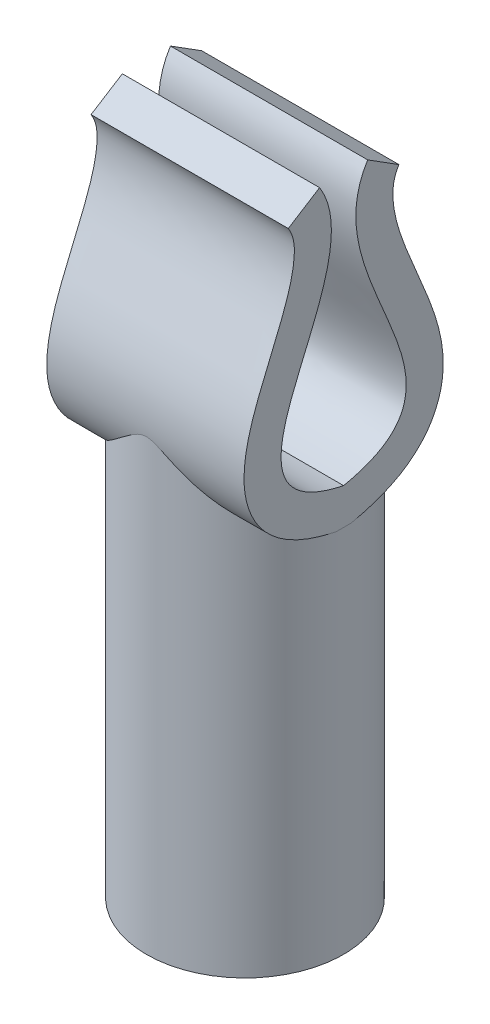
ISO-10303-21;
HEADER;
FILE_DESCRIPTION(('STEP AP214'),'2;1');
FILE_NAME('part.step','',(''),(''),'','','');
FILE_SCHEMA(('AUTOMOTIVE_DESIGN { 1 0 10303 214 1 1 1 1 }'));
ENDSEC;
DATA;
#1=APPLICATION_CONTEXT('core data for automotive mechanical design processes');
#2=APPLICATION_PROTOCOL_DEFINITION('international standard','automotive_design',2000,#1);
#3=PRODUCT_CONTEXT('',#1,'mechanical');
#4=PRODUCT('Part','Part','',(#3));
#5=PRODUCT_RELATED_PRODUCT_CATEGORY('part','',(#4));
#6=PRODUCT_DEFINITION_FORMATION('','',#4);
#7=PRODUCT_DEFINITION_CONTEXT('part definition',#1,'design');
#8=PRODUCT_DEFINITION('design','',#6,#7);
#9=PRODUCT_DEFINITION_SHAPE('','',#8);
#10=(LENGTH_UNIT() NAMED_UNIT(*) SI_UNIT(.MILLI.,.METRE.));
#11=(NAMED_UNIT(*) PLANE_ANGLE_UNIT() SI_UNIT($,.RADIAN.));
#12=(NAMED_UNIT(*) SI_UNIT($,.STERADIAN.) SOLID_ANGLE_UNIT());
#13=UNCERTAINTY_MEASURE_WITH_UNIT(LENGTH_MEASURE(1.E-05),#10,'distance_accuracy_value','');
#14=(GEOMETRIC_REPRESENTATION_CONTEXT(3) GLOBAL_UNCERTAINTY_ASSIGNED_CONTEXT((#13)) GLOBAL_UNIT_ASSIGNED_CONTEXT((#10,
#11,#12)) REPRESENTATION_CONTEXT('',''));
#15=CARTESIAN_POINT('',(0.,0.,0.));
#16=DIRECTION('',(0.,0.,1.));
#17=DIRECTION('',(1.,0.,0.));
#18=AXIS2_PLACEMENT_3D('',#15,#16,#17);
#19=CARTESIAN_POINT('',(4.,7.03164583504196,0.));
#20=DIRECTION('',(0.,1.,0.));
#21=DIRECTION('',(0.,0.,1.));
#22=AXIS2_PLACEMENT_3D('',#19,#20,#21);
#23=PLANE('',#22);
#24=DIRECTION('',(-1.,0.,0.));
#25=VECTOR('',#24,1.);
#26=CARTESIAN_POINT('',(4.,7.03164583504196,0.306489879523566));
#27=LINE('',#26,#25);
#28=CARTESIAN_POINT('',(4.,7.03164583504196,0.306489879523566));
#29=VERTEX_POINT('',#28);
#30=CARTESIAN_POINT('',(3.9882407091034,7.03164583504196,0.306489879523566));
#31=VERTEX_POINT('',#30);
#32=EDGE_CURVE('E137',#29,#31,#27,.T.);
#33=ORIENTED_EDGE('',*,*,#32,.T.);
#34=CARTESIAN_POINT('',(0.,7.03164583504196,0.));
#35=DIRECTION('',(0.,1.,0.));
#36=DIRECTION('',(0.,0.,1.));
#37=AXIS2_PLACEMENT_3D('',#34,#35,#36);
#38=CIRCLE('',#37,4.);
#39=CARTESIAN_POINT('',(4.,7.03164583504196,0.));
#40=VERTEX_POINT('',#39);
#41=EDGE_CURVE('E148',#40,#31,#38,.F.);
#42=ORIENTED_EDGE('',*,*,#41,.F.);
#43=DIRECTION('',(0.,0.,-1.));
#44=VECTOR('',#43,1.);
#45=CARTESIAN_POINT('',(4.,7.03164583504196,0.));
#46=LINE('',#45,#44);
#47=EDGE_CURVE('E234',#29,#40,#46,.T.);
#48=ORIENTED_EDGE('',*,*,#47,.F.);
#49=EDGE_LOOP('',(#33,#42,#48));
#50=FACE_BOUND('',#49,.T.);
#51=ADVANCED_FACE('F41',(#50),#23,.F.);
#52=CARTESIAN_POINT('',(4.,7.03164583504196,-0.306489879523566));
#53=VERTEX_POINT('',#52);
#54=EDGE_CURVE('E259',#40,#53,#46,.T.);
#55=ORIENTED_EDGE('',*,*,#54,.F.);
#56=CARTESIAN_POINT('',(3.98824070910341,7.03164583504196,-0.306489879523566));
#57=VERTEX_POINT('',#56);
#58=EDGE_CURVE('E69',#57,#40,#38,.F.);
#59=ORIENTED_EDGE('',*,*,#58,.F.);
#60=DIRECTION('',(-1.,0.,0.));
#61=VECTOR('',#60,1.);
#62=CARTESIAN_POINT('',(4.,7.03164583504196,-0.306489879523566));
#63=LINE('',#62,#61);
#64=EDGE_CURVE('E53',#53,#57,#63,.T.);
#65=ORIENTED_EDGE('',*,*,#64,.F.);
#66=EDGE_LOOP('',(#55,#59,#65));
#67=FACE_BOUND('',#66,.T.);
#68=ADVANCED_FACE('F346',(#67),#23,.F.);
#69=CARTESIAN_POINT('',(-3.98824070910341,7.03164583504196,-0.306489879523566));
#70=VERTEX_POINT('',#69);
#71=CARTESIAN_POINT('',(-4.,7.03164583504196,-0.306489879523566));
#72=VERTEX_POINT('',#71);
#73=EDGE_CURVE('E46',#70,#72,#63,.T.);
#74=ORIENTED_EDGE('',*,*,#73,.F.);
#75=CARTESIAN_POINT('',(-4.,7.03164583504196,0.));
#76=VERTEX_POINT('',#75);
#77=EDGE_CURVE('E146',#76,#70,#38,.F.);
#78=ORIENTED_EDGE('',*,*,#77,.F.);
#79=DIRECTION('',(0.,0.,-1.));
#80=VECTOR('',#79,1.);
#81=CARTESIAN_POINT('',(-4.,7.03164583504196,0.));
#82=LINE('',#81,#80);
#83=EDGE_CURVE('E253',#76,#72,#82,.T.);
#84=ORIENTED_EDGE('',*,*,#83,.T.);
#85=EDGE_LOOP('',(#74,#78,#84));
#86=FACE_BOUND('',#85,.T.);
#87=ADVANCED_FACE('F313',(#86),#23,.F.);
#88=CARTESIAN_POINT('',(-4.,7.03164583504196,0.306489879523566));
#89=VERTEX_POINT('',#88);
#90=EDGE_CURVE('E142',#89,#76,#82,.T.);
#91=ORIENTED_EDGE('',*,*,#90,.T.);
#92=CARTESIAN_POINT('',(-3.9882407091034,7.03164583504196,0.306489879523566));
#93=VERTEX_POINT('',#92);
#94=EDGE_CURVE('E140',#93,#76,#38,.F.);
#95=ORIENTED_EDGE('',*,*,#94,.F.);
#96=EDGE_CURVE('E124',#93,#89,#27,.T.);
#97=ORIENTED_EDGE('',*,*,#96,.T.);
#98=EDGE_LOOP('',(#91,#95,#97));
#99=FACE_BOUND('',#98,.T.);
#100=ADVANCED_FACE('F141',(#99),#23,.F.);
#101=CARTESIAN_POINT('',(4.,7.03164583504196,-0.306489879523566));
#102=CARTESIAN_POINT('',(4.,7.07829473029853,-0.529978823912705));
#103=CARTESIAN_POINT('',(4.,7.19011564463256,-0.984294969082046));
#104=CARTESIAN_POINT('',(4.,7.46538874891517,-1.78859758283275));
#105=CARTESIAN_POINT('',(4.,7.9377015792707,-2.6821833740175));
#106=CARTESIAN_POINT('',(4.,8.79289043839185,-3.53008841360021));
#107=CARTESIAN_POINT('',(4.,9.86950815960972,-3.99375196436386));
#108=CARTESIAN_POINT('',(4.,10.9200616971611,-4.07326898230156));
#109=CARTESIAN_POINT('',(4.,12.1870395307715,-3.8853574623859));
#110=CARTESIAN_POINT('',(4.,13.6180263802724,-3.36010862412962));
#111=CARTESIAN_POINT('',(4.,15.2523621249921,-2.63599918272506));
#112=CARTESIAN_POINT('',(4.,16.7588465155459,-2.07993407535756));
#113=CARTESIAN_POINT('',(4.,17.9329515339334,-1.93748110870911));
#114=CARTESIAN_POINT('',(4.,18.4202873447502,-2.09625883810497));
#115=CARTESIAN_POINT('',(4.,18.6549413655216,-2.24420265934673));
#116=B_SPLINE_CURVE_WITH_KNOTS('',3,(#101,#102,#103,#104,#105,#106,#107,#108,#109,#110,#111,
#112,#113,#114,#115),.UNSPECIFIED.,.F.,.F.,(4,1,1,1,1,1,1,1,1,1,1,1,4),(0.,0.03125,0.0625,0.125,
0.1875,0.25,0.3125,0.375,0.5,0.625,0.75,0.875,1.),.UNSPECIFIED.);
#117=DIRECTION('',(-1.,0.,0.));
#118=VECTOR('',#117,1.);
#119=SURFACE_OF_LINEAR_EXTRUSION('',#116,#118);
#120=ORIENTED_EDGE('',*,*,#64,.T.);
#121=CARTESIAN_POINT('',(-3.98824070910341,7.03164583504196,-0.306489879523566));
#122=CARTESIAN_POINT('',(-3.98405283103163,7.04302816264918,-0.360997256579708));
#123=CARTESIAN_POINT('',(-3.97875310302046,7.05486801810956,-0.415322195721255));
#124=CARTESIAN_POINT('',(-3.96596833131764,7.07945272145702,-0.523507570965624));
#125=CARTESIAN_POINT('',(-3.95848331576204,7.09219755769067,-0.577368013039755));
#126=CARTESIAN_POINT('',(-3.94136873007118,7.1185786197941,-0.684510607986535));
#127=CARTESIAN_POINT('',(-3.93173978367505,7.13221458559182,-0.737792924336011));
#128=CARTESIAN_POINT('',(-3.91038487089869,7.16039979463419,-0.843687680076051));
#129=CARTESIAN_POINT('',(-3.89865890063233,7.17494903957126,-0.896300118225026));
#130=CARTESIAN_POINT('',(-3.86051869782255,7.21994128851747,-1.05254448535815));
#131=CARTESIAN_POINT('',(-3.83106865233917,7.251839809395,-1.15503964507691));
#132=CARTESIAN_POINT('',(-3.76459056897165,7.31971784269199,-1.35612761225122));
#133=CARTESIAN_POINT('',(-3.72756232222633,7.3556974675777,-1.45472031206252));
#134=CARTESIAN_POINT('',(-3.6465166760738,7.43151701711118,-1.6473691348383));
#135=CARTESIAN_POINT('',(-3.60250334834641,7.47135468762132,-1.74142785931884));
#136=CARTESIAN_POINT('',(-3.50812703518449,7.55492038578552,-1.92448751734082));
#137=CARTESIAN_POINT('',(-3.45776402652973,7.59864842766615,-2.01348843238455));
#138=CARTESIAN_POINT('',(-3.3513788025478,7.68997761676463,-2.18598462180309));
#139=CARTESIAN_POINT('',(-3.29535522848757,7.73757969334992,-2.26947856632594));
#140=CARTESIAN_POINT('',(-3.17839092239686,7.83647156559751,-2.43058640918756));
#141=CARTESIAN_POINT('',(-3.11745015615907,7.88776138691397,-2.50820026661322));
#142=CARTESIAN_POINT('',(-2.91984230061578,8.05389309392452,-2.74187552475354));
#143=CARTESIAN_POINT('',(-2.77553744146553,8.17495742561499,-2.88729349370202));
#144=CARTESIAN_POINT('',(-2.54859453666478,8.36523427425642,-3.08460285605666));
#145=CARTESIAN_POINT('',(-2.47110009504162,8.4301897025046,-3.14696525944243));
#146=CARTESIAN_POINT('',(-2.31315451933374,8.56274327078663,-3.26481357243536));
#147=CARTESIAN_POINT('',(-2.23270374887683,8.63034108587224,-3.32030032409994));
#148=CARTESIAN_POINT('',(-2.11122671423137,8.73278197411684,-3.3977879085054));
#149=CARTESIAN_POINT('',(-2.07106735860551,8.76670688847091,-3.4224083347003));
#150=CARTESIAN_POINT('',(-1.9902836970055,8.8351483200708,-3.47000978981311));
#151=CARTESIAN_POINT('',(-1.94965940042187,8.8696648253751,-3.49299085177406));
#152=CARTESIAN_POINT('',(-1.82709112260131,8.97402265521261,-3.55954954905926));
#153=CARTESIAN_POINT('',(-1.74448948078188,9.04464044373321,-3.60071873124575));
#154=CARTESIAN_POINT('',(-1.57747744315206,9.18717383220193,-3.67695505661959));
#155=CARTESIAN_POINT('',(-1.49306538850701,9.259090611951,-3.71201630931468));
#156=CARTESIAN_POINT('',(-1.32247303944383,9.40323013764949,-3.77615725697355));
#157=CARTESIAN_POINT('',(-1.23629551498162,9.47545228144013,-3.80524563476213));
#158=CARTESIAN_POINT('',(-1.10533638280667,9.58321966206353,-3.84451581192061));
#159=CARTESIAN_POINT('',(-1.0614180604806,9.61903443122357,-3.85687497072196));
#160=CARTESIAN_POINT('',(-0.972897655960138,9.69028411444549,-3.88015026940244));
#161=CARTESIAN_POINT('',(-0.928295622036755,9.72571905502637,-3.89106651063472));
#162=CARTESIAN_POINT('',(-0.838312503319054,9.79587635297652,-3.9114392238495));
#163=CARTESIAN_POINT('',(-0.79293263174264,9.83059966224615,-3.92089777352903));
#164=CARTESIAN_POINT('',(-0.701086138300713,9.89894990749165,-3.93835841981289));
#165=CARTESIAN_POINT('',(-0.654619818803334,9.93257714242169,-3.94636091633087));
#166=CARTESIAN_POINT('',(-0.582231778533317,9.98252363531381,-3.95748021015788));
#167=CARTESIAN_POINT('',(-0.556891761656486,9.99956591363384,-3.96112857918105));
#168=CARTESIAN_POINT('',(-0.505626589371762,10.0328537625207,-3.96799840643277));
#169=CARTESIAN_POINT('',(-0.479701327948628,10.0490991870211,-3.97121978657546));
#170=CARTESIAN_POINT('',(-0.427147096315249,10.0804547842532,-3.97721565291266));
#171=CARTESIAN_POINT('',(-0.400518787402315,10.0955659758066,-3.9799905427921));
#172=CARTESIAN_POINT('',(-0.346375432526357,10.1241839352503,-3.98506746231384));
#173=CARTESIAN_POINT('',(-0.318860771163875,10.1376913874143,-3.98736969393504));
#174=CARTESIAN_POINT('',(-0.255641524392388,10.1655807370784,-3.99197858373963));
#175=CARTESIAN_POINT('',(-0.219629933503674,10.1793152648135,-3.99413821847426));
#176=CARTESIAN_POINT('',(-0.145944251269591,10.2012597845424,-3.99750464312788));
#177=CARTESIAN_POINT('',(-0.108277079935239,10.2094908021929,-3.99871506253835));
#178=CARTESIAN_POINT('',(-0.0508393225910899,10.2163897004344,-3.99972404834428));
#179=CARTESIAN_POINT('',(-0.0313902751952663,10.2177708805299,-3.99992434839597));
#180=CARTESIAN_POINT('',(0.00755117227900924,10.2185676452993,-4.00004013260857));
#181=CARTESIAN_POINT('',(0.0270435687934826,10.2179833859973,-3.99995563937744));
#182=CARTESIAN_POINT('',(0.0658921018300201,10.2148867223586,-3.99950452758042));
#183=CARTESIAN_POINT('',(0.0852480365429091,10.2123718980602,-3.99913755492522));
#184=CARTESIAN_POINT('',(0.123646057987396,10.2055883955333,-3.99813468363372));
#185=CARTESIAN_POINT('',(0.142687980398678,10.2013188275711,-3.99749864856593));
#186=CARTESIAN_POINT('',(0.187526187592627,10.189362939954,-3.99568657976616));
#187=CARTESIAN_POINT('',(0.213134719088906,10.1809946760937,-3.99439715540143));
#188=CARTESIAN_POINT('',(0.263500488518636,10.1620763022572,-3.99139140180265));
#189=CARTESIAN_POINT('',(0.288257180212547,10.1515248216277,-3.98967480424556));
#190=CARTESIAN_POINT('',(0.33711922671321,10.1287571052821,-3.98584426148402));
#191=CARTESIAN_POINT('',(0.36122017823582,10.11653191212,-3.98372815334788));
#192=CARTESIAN_POINT('',(0.408735056297504,10.090903423664,-3.9791337026025));
#193=CARTESIAN_POINT('',(0.432149167793091,10.0775004494876,-3.97665545860686));
#194=CARTESIAN_POINT('',(0.488333193154791,10.0439030159865,-3.97021892143394));
#195=CARTESIAN_POINT('',(0.520812540284977,10.0232595354098,-3.96608148780748));
#196=CARTESIAN_POINT('',(0.584922853454069,9.98082525893608,-3.95713435164514));
#197=CARTESIAN_POINT('',(0.616553525672564,9.95903407323428,-3.95232441977321));
#198=CARTESIAN_POINT('',(0.679220774335061,9.91465188569851,-3.94203869362736));
#199=CARTESIAN_POINT('',(0.710256206175684,9.89205954264754,-3.93656174140063));
#200=CARTESIAN_POINT('',(0.771824306578336,9.84636181751774,-3.92495448350654));
#201=CARTESIAN_POINT('',(0.802356935841111,9.82325639566481,-3.91882412704603));
#202=CARTESIAN_POINT('',(0.893387033505228,9.75336537056618,-3.89945070096032));
#203=CARTESIAN_POINT('',(0.953266226080558,9.70604158467829,-3.88523363427098));
#204=CARTESIAN_POINT('',(1.07191178488216,9.61062823709599,-3.8541884386432));
#205=CARTESIAN_POINT('',(1.13067579002294,9.56253737794882,-3.83735534179306));
#206=CARTESIAN_POINT('',(1.24713087368748,9.46618155371222,-3.80110232163875));
#207=CARTESIAN_POINT('',(1.30482315049787,9.41791686537163,-3.78168551378743));
#208=CARTESIAN_POINT('',(1.41932499193763,9.32149398537577,-3.74021696486565));
#209=CARTESIAN_POINT('',(1.47613470504213,9.27333577700241,-3.71816567254398));
#210=CARTESIAN_POINT('',(1.59092759227571,9.17570647221116,-3.67055095628904));
#211=CARTESIAN_POINT('',(1.64888217692771,9.12624846897247,-3.64489157236545));
#212=CARTESIAN_POINT('',(1.76396379881129,9.02798878915523,-3.59060995454607));
#213=CARTESIAN_POINT('',(1.82109078160268,8.97918715576808,-3.56198752673911));
#214=CARTESIAN_POINT('',(1.93455049957209,8.88250225150717,-3.5016629860887));
#215=CARTESIAN_POINT('',(1.99088282530256,8.83461944979069,-3.46995934757643));
#216=CARTESIAN_POINT('',(2.10263643451276,8.73999512369983,-3.4034022804509));
#217=CARTESIAN_POINT('',(2.158057738664,8.69325357341822,-3.36854892342309));
#218=CARTESIAN_POINT('',(2.26763386529706,8.60101025035019,-3.29577803786457));
#219=CARTESIAN_POINT('',(2.32179138493322,8.55550579484547,-3.25786798936053));
#220=CARTESIAN_POINT('',(2.4287839398402,8.46569499894749,-3.17890403423551));
#221=CARTESIAN_POINT('',(2.48161893464576,8.42138869521071,-3.13785003157468));
#222=CARTESIAN_POINT('',(2.63782626555723,8.29041156381997,-3.00997837402342));
#223=CARTESIAN_POINT('',(2.73897029625553,8.20562434323371,-2.91840536402363));
#224=CARTESIAN_POINT('',(2.90972980020286,8.06233115087673,-2.74669251933424));
#225=CARTESIAN_POINT('',(2.98098282053822,8.00248898273056,-2.66927741364593));
#226=CARTESIAN_POINT('',(3.11847714019249,7.88689973354956,-2.50726469391196));
#227=CARTESIAN_POINT('',(3.18471929565554,7.83115195300522,-2.42266831210724));
#228=CARTESIAN_POINT('',(3.3113019505325,7.72405994712045,-2.24656159965423));
#229=CARTESIAN_POINT('',(3.37164300171616,7.67271531012917,-2.15505191683984));
#230=CARTESIAN_POINT('',(3.48551605155661,7.5746188129915,-1.96555116018678));
#231=CARTESIAN_POINT('',(3.53904821707552,7.52786684030129,-1.86756024527007));
#232=CARTESIAN_POINT('',(3.63439486729112,7.44252756615793,-1.67387950177786));
#233=CARTESIAN_POINT('',(3.67680556329731,7.40358600619296,-1.57863874574187));
#234=CARTESIAN_POINT('',(3.75447780086535,7.32963204503906,-1.3837973398905));
#235=CARTESIAN_POINT('',(3.78973900372272,7.29461983003638,-1.28419648378872));
#236=CARTESIAN_POINT('',(3.85249104531977,7.22874295112647,-1.08145774293377));
#237=CARTESIAN_POINT('',(3.87999535454191,7.19787114658181,-0.978326343015627));
#238=CARTESIAN_POINT('',(3.92679819189405,7.13986605828849,-0.769236110763174));
#239=CARTESIAN_POINT('',(3.94610125418074,7.112730714417,-0.663278875254082));
#240=CARTESIAN_POINT('',(3.96693602093165,7.07752915541253,-0.514945478303809));
#241=CARTESIAN_POINT('',(3.97210842190944,7.06796935043256,-0.473405662718375));
#242=CARTESIAN_POINT('',(3.98115118710539,7.04939747102838,-0.39011133003229));
#243=CARTESIAN_POINT('',(3.98502297909151,7.04038480493903,-0.34835709979016));
#244=CARTESIAN_POINT('',(3.98824070910341,7.03164583504196,-0.306489879523566));
#245=B_SPLINE_CURVE_WITH_KNOTS('',3,(#121,#122,#123,#124,#125,#126,#127,#128,#129,#130,#131,
#132,#133,#134,#135,#136,#137,#138,#139,#140,#141,#142,#143,#144,#145,#146,#147,#148,#149,#150,
#151,#152,#153,#154,#155,#156,#157,#158,#159,#160,#161,#162,#163,#164,#165,#166,#167,#168,#169,
#170,#171,#172,#173,#174,#175,#176,#177,#178,#179,#180,#181,#182,#183,#184,#185,#186,#187,#188,
#189,#190,#191,#192,#193,#194,#195,#196,#197,#198,#199,#200,#201,#202,#203,#204,#205,#206,#207,
#208,#209,#210,#211,#212,#213,#214,#215,#216,#217,#218,#219,#220,#221,#222,#223,#224,#225,#226,
#227,#228,#229,#230,#231,#232,#233,#234,#235,#236,#237,#238,#239,#240,#241,#242,#243,#244),
.UNSPECIFIED.,.F.,.F.,(4,2,2,2,2,2,2,2,2,2,2,2,2,2,2,2,2,2,2,2,2,2,2,2,2,2,2,2,2,2,2,2,2,2,2,2,
2,2,2,2,2,2,2,2,2,2,2,2,2,2,2,2,2,2,2,2,2,2,2,2,2,4),(0.,0.167505622546573,0.335009088517145,
0.502463885816501,0.669918993440763,1.00340824782874,1.33690669467991,1.67021145088378,
2.0035174259892,2.33690359707709,2.67029208762306,3.38104135618793,3.73727101562797,
4.09345700460114,4.26758664088216,4.44171276641215,4.7901293855521,5.13888017987863,
5.48712034544459,5.66110939225577,5.83508621126086,6.00881271494701,6.18249143135085,
6.27474240765263,6.36701023120171,6.45919415817277,6.55133861023318,6.66685744482401,
6.78193238942608,6.84033772323703,6.8987384207187,6.95721244320075,7.01571615128245,
7.0964872778987,7.17730926843671,7.25858207054895,7.33983278228103,7.45590253685892,
7.5720119706494,7.68832592420017,7.80464892615601,8.03748345868296,8.27076567852392,
8.50376911215728,8.73673291324404,8.97785615509994,9.21899518682652,9.46025423340889,
9.70150779813591,9.94218793562891,10.1828754282266,10.6639473010408,11.0267376458219,
11.389465864464,11.7521601345114,12.11484551447,12.4483534511,12.7818771838497,13.1148181078513,
13.4475747212304,13.576371100582,13.7050256256744),.UNSPECIFIED.);
#246=EDGE_CURVE('E61',#70,#57,#245,.T.);
#247=ORIENTED_EDGE('',*,*,#246,.F.);
#248=ORIENTED_EDGE('',*,*,#73,.T.);
#249=CARTESIAN_POINT('',(-4.,7.03164583504196,-0.306489879523566));
#250=CARTESIAN_POINT('',(-4.,7.07829473029853,-0.529978823912705));
#251=CARTESIAN_POINT('',(-4.,7.19011564463256,-0.984294969082046));
#252=CARTESIAN_POINT('',(-4.,7.46538874891517,-1.78859758283275));
#253=CARTESIAN_POINT('',(-4.,7.9377015792707,-2.6821833740175));
#254=CARTESIAN_POINT('',(-4.,8.79289043839185,-3.53008841360021));
#255=CARTESIAN_POINT('',(-4.,9.86950815960972,-3.99375196436386));
#256=CARTESIAN_POINT('',(-4.,10.9200616971611,-4.07326898230156));
#257=CARTESIAN_POINT('',(-4.,12.1870395307715,-3.8853574623859));
#258=CARTESIAN_POINT('',(-4.,13.6180263802724,-3.36010862412962));
#259=CARTESIAN_POINT('',(-4.,15.2523621249921,-2.63599918272506));
#260=CARTESIAN_POINT('',(-4.,16.7588465155459,-2.07993407535756));
#261=CARTESIAN_POINT('',(-4.,17.9329515339334,-1.93748110870911));
#262=CARTESIAN_POINT('',(-4.,18.4202873447502,-2.09625883810497));
#263=CARTESIAN_POINT('',(-4.,18.6549413655216,-2.24420265934673));
#264=B_SPLINE_CURVE_WITH_KNOTS('',3,(#249,#250,#251,#252,#253,#254,#255,#256,#257,#258,#259,
#260,#261,#262,#263),.UNSPECIFIED.,.F.,.F.,(4,1,1,1,1,1,1,1,1,1,1,1,4),(0.,0.03125,0.0625,0.125,
0.1875,0.25,0.3125,0.375,0.5,0.625,0.75,0.875,1.),.UNSPECIFIED.);
#265=CARTESIAN_POINT('',(-4.,18.6549413655216,-2.24420265934673));
#266=VERTEX_POINT('',#265);
#267=EDGE_CURVE('E299',#72,#266,#264,.T.);
#268=ORIENTED_EDGE('',*,*,#267,.T.);
#269=DIRECTION('',(-1.,0.,0.));
#270=VECTOR('',#269,1.);
#271=CARTESIAN_POINT('',(4.,18.6549413655216,-2.24420265934673));
#272=LINE('',#271,#270);
#273=CARTESIAN_POINT('',(4.,18.6549413655216,-2.24420265934673));
#274=VERTEX_POINT('',#273);
#275=EDGE_CURVE('E289',#274,#266,#272,.T.);
#276=ORIENTED_EDGE('',*,*,#275,.F.);
#277=EDGE_CURVE('E226',#53,#274,#116,.T.);
#278=ORIENTED_EDGE('',*,*,#277,.F.);
#279=EDGE_LOOP('',(#120,#247,#248,#268,#276,#278));
#280=FACE_BOUND('',#279,.T.);
#281=ADVANCED_FACE('F223',(#280),#119,.F.);
#282=CARTESIAN_POINT('',(4.,19.4549305343332,-0.97533807642857));
#283=CARTESIAN_POINT('',(4.,15.650726712737,1.42312263734572));
#284=CARTESIAN_POINT('',(4.,9.81616264931179,-6.30556842817573));
#285=CARTESIAN_POINT('',(4.,8.5,0.));
#286=B_SPLINE_CURVE_WITH_KNOTS('',3,(#282,#283,#284,#285),.UNSPECIFIED.,.F.,.F.,(4,4),(0.,1.),.UNSPECIFIED.);
#287=DIRECTION('',(-1.,0.,0.));
#288=VECTOR('',#287,1.);
#289=SURFACE_OF_LINEAR_EXTRUSION('',#286,#288);
#290=CARTESIAN_POINT('',(-4.,19.4549305343332,-0.97533807642857));
#291=CARTESIAN_POINT('',(-4.,15.650726712737,1.42312263734572));
#292=CARTESIAN_POINT('',(-4.,9.81616264931179,-6.30556842817573));
#293=CARTESIAN_POINT('',(-4.,8.5,0.));
#294=B_SPLINE_CURVE_WITH_KNOTS('',3,(#290,#291,#292,#293),.UNSPECIFIED.,.F.,.F.,(4,4),(0.,1.),.UNSPECIFIED.);
#295=CARTESIAN_POINT('',(-4.,19.4549305343332,-0.97533807642857));
#296=VERTEX_POINT('',#295);
#297=CARTESIAN_POINT('',(-4.,8.5,0.));
#298=VERTEX_POINT('',#297);
#299=EDGE_CURVE('E250',#296,#298,#294,.T.);
#300=ORIENTED_EDGE('',*,*,#299,.T.);
#301=DIRECTION('',(-1.,0.,0.));
#302=VECTOR('',#301,1.);
#303=CARTESIAN_POINT('',(4.,8.5,0.));
#304=LINE('',#303,#302);
#305=CARTESIAN_POINT('',(4.,8.5,0.));
#306=VERTEX_POINT('',#305);
#307=EDGE_CURVE('E11',#306,#298,#304,.T.);
#308=ORIENTED_EDGE('',*,*,#307,.F.);
#309=CARTESIAN_POINT('',(4.,19.4549305343332,-0.97533807642857));
#310=VERTEX_POINT('',#309);
#311=EDGE_CURVE('E257',#310,#306,#286,.T.);
#312=ORIENTED_EDGE('',*,*,#311,.F.);
#313=DIRECTION('',(-1.,0.,0.));
#314=VECTOR('',#313,1.);
#315=CARTESIAN_POINT('',(4.,19.4549305343332,-0.97533807642857));
#316=LINE('',#315,#314);
#317=EDGE_CURVE('E240',#310,#296,#316,.T.);
#318=ORIENTED_EDGE('',*,*,#317,.T.);
#319=EDGE_LOOP('',(#300,#308,#312,#318));
#320=FACE_BOUND('',#319,.T.);
#321=ADVANCED_FACE('F43',(#320),#289,.F.);
#322=CARTESIAN_POINT('',(4.,19.4549305343332,-0.97533807642857));
#323=DIRECTION('',(0.,-0.845909721945438,0.53332611254109));
#324=DIRECTION('',(0.,-0.53332611254109,-0.845909721945438));
#325=AXIS2_PLACEMENT_3D('',#322,#323,#324);
#326=PLANE('',#325);
#327=DIRECTION('',(0.,0.53332611254109,0.845909721945438));
#328=VECTOR('',#327,1.);
#329=CARTESIAN_POINT('',(-4.,19.4549305343332,-0.97533807642857));
#330=LINE('',#329,#328);
#331=EDGE_CURVE('E260',#266,#296,#330,.T.);
#332=ORIENTED_EDGE('',*,*,#331,.T.);
#333=ORIENTED_EDGE('',*,*,#317,.F.);
#334=DIRECTION('',(0.,0.53332611254109,0.845909721945438));
#335=VECTOR('',#334,1.);
#336=CARTESIAN_POINT('',(4.,19.4549305343332,-0.97533807642857));
#337=LINE('',#336,#335);
#338=EDGE_CURVE('E233',#274,#310,#337,.T.);
#339=ORIENTED_EDGE('',*,*,#338,.F.);
#340=ORIENTED_EDGE('',*,*,#275,.T.);
#341=EDGE_LOOP('',(#332,#333,#339,#340));
#342=FACE_BOUND('',#341,.T.);
#343=ADVANCED_FACE('F215',(#342),#326,.F.);
#344=CARTESIAN_POINT('',(4.,13.04444982756,-1.95283443111482));
#345=DIRECTION('',(-1.,0.,0.));
#346=DIRECTION('',(0.,0.,1.));
#347=AXIS2_PLACEMENT_3D('',#344,#345,#346);
#348=PLANE('',#347);
#349=ORIENTED_EDGE('',*,*,#311,.T.);
#350=CARTESIAN_POINT('',(4.,19.4549305343332,0.97533807642857));
#351=CARTESIAN_POINT('',(4.,15.650726712737,-1.42312263734572));
#352=CARTESIAN_POINT('',(4.,9.81616264931179,6.30556842817573));
#353=CARTESIAN_POINT('',(4.,8.5,0.));
#354=B_SPLINE_CURVE_WITH_KNOTS('',3,(#350,#351,#352,#353),.UNSPECIFIED.,.F.,.F.,(4,4),(0.,1.),.UNSPECIFIED.);
#355=CARTESIAN_POINT('',(4.,19.4549305343332,0.97533807642857));
#356=VERTEX_POINT('',#355);
#357=EDGE_CURVE('E189',#356,#306,#354,.T.);
#358=ORIENTED_EDGE('',*,*,#357,.F.);
#359=DIRECTION('',(0.,0.53332611254109,-0.845909721945438));
#360=VECTOR('',#359,1.);
#361=CARTESIAN_POINT('',(4.,19.4549305343332,0.97533807642857));
#362=LINE('',#361,#360);
#363=CARTESIAN_POINT('',(4.,18.6549413655216,2.24420265934673));
#364=VERTEX_POINT('',#363);
#365=EDGE_CURVE('E199',#364,#356,#362,.T.);
#366=ORIENTED_EDGE('',*,*,#365,.F.);
#367=CARTESIAN_POINT('',(4.,7.03164583504196,0.306489879523566));
#368=CARTESIAN_POINT('',(4.,7.07829473029853,0.529978823912705));
#369=CARTESIAN_POINT('',(4.,7.19011564463256,0.984294969082046));
#370=CARTESIAN_POINT('',(4.,7.46538874891517,1.78859758283275));
#371=CARTESIAN_POINT('',(4.,7.9377015792707,2.6821833740175));
#372=CARTESIAN_POINT('',(4.,8.79289043839185,3.53008841360021));
#373=CARTESIAN_POINT('',(4.,9.86950815960972,3.99375196436386));
#374=CARTESIAN_POINT('',(4.,10.9200616971611,4.07326898230156));
#375=CARTESIAN_POINT('',(4.,12.1870395307715,3.8853574623859));
#376=CARTESIAN_POINT('',(4.,13.6180263802724,3.36010862412962));
#377=CARTESIAN_POINT('',(4.,15.2523621249921,2.63599918272506));
#378=CARTESIAN_POINT('',(4.,16.7588465155459,2.07993407535756));
#379=CARTESIAN_POINT('',(4.,17.9329515339334,1.93748110870911));
#380=CARTESIAN_POINT('',(4.,18.4202873447502,2.09625883810497));
#381=CARTESIAN_POINT('',(4.,18.6549413655216,2.24420265934673));
#382=B_SPLINE_CURVE_WITH_KNOTS('',3,(#367,#368,#369,#370,#371,#372,#373,#374,#375,#376,#377,
#378,#379,#380,#381),.UNSPECIFIED.,.F.,.F.,(4,1,1,1,1,1,1,1,1,1,1,1,4),(0.,0.03125,0.0625,0.125,
0.1875,0.25,0.3125,0.375,0.5,0.625,0.75,0.875,1.),.UNSPECIFIED.);
#383=EDGE_CURVE('E138',#29,#364,#382,.T.);
#384=ORIENTED_EDGE('',*,*,#383,.F.);
#385=ORIENTED_EDGE('',*,*,#47,.T.);
#386=ORIENTED_EDGE('',*,*,#54,.T.);
#387=ORIENTED_EDGE('',*,*,#277,.T.);
#388=ORIENTED_EDGE('',*,*,#338,.T.);
#389=EDGE_LOOP('',(#349,#358,#366,#384,#385,#386,#387,#388));
#390=FACE_BOUND('',#389,.T.);
#391=ADVANCED_FACE('F211',(#390),#348,.F.);
#392=CARTESIAN_POINT('',(-4.,13.04444982756,-1.95283443111482));
#393=DIRECTION('',(-1.,0.,0.));
#394=DIRECTION('',(0.,0.,1.));
#395=AXIS2_PLACEMENT_3D('',#392,#393,#394);
#396=PLANE('',#395);
#397=ORIENTED_EDGE('',*,*,#299,.F.);
#398=ORIENTED_EDGE('',*,*,#331,.F.);
#399=ORIENTED_EDGE('',*,*,#267,.F.);
#400=ORIENTED_EDGE('',*,*,#83,.F.);
#401=ORIENTED_EDGE('',*,*,#90,.F.);
#402=CARTESIAN_POINT('',(-4.,7.03164583504196,0.306489879523566));
#403=CARTESIAN_POINT('',(-4.,7.07829473029853,0.529978823912705));
#404=CARTESIAN_POINT('',(-4.,7.19011564463256,0.984294969082046));
#405=CARTESIAN_POINT('',(-4.,7.46538874891517,1.78859758283275));
#406=CARTESIAN_POINT('',(-4.,7.9377015792707,2.6821833740175));
#407=CARTESIAN_POINT('',(-4.,8.79289043839185,3.53008841360021));
#408=CARTESIAN_POINT('',(-4.,9.86950815960972,3.99375196436386));
#409=CARTESIAN_POINT('',(-4.,10.9200616971611,4.07326898230156));
#410=CARTESIAN_POINT('',(-4.,12.1870395307715,3.8853574623859));
#411=CARTESIAN_POINT('',(-4.,13.6180263802724,3.36010862412962));
#412=CARTESIAN_POINT('',(-4.,15.2523621249921,2.63599918272506));
#413=CARTESIAN_POINT('',(-4.,16.7588465155459,2.07993407535756));
#414=CARTESIAN_POINT('',(-4.,17.9329515339334,1.93748110870911));
#415=CARTESIAN_POINT('',(-4.,18.4202873447502,2.09625883810497));
#416=CARTESIAN_POINT('',(-4.,18.6549413655216,2.24420265934673));
#417=B_SPLINE_CURVE_WITH_KNOTS('',3,(#402,#403,#404,#405,#406,#407,#408,#409,#410,#411,#412,
#413,#414,#415,#416),.UNSPECIFIED.,.F.,.F.,(4,1,1,1,1,1,1,1,1,1,1,1,4),(0.,0.03125,0.0625,0.125,
0.1875,0.25,0.3125,0.375,0.5,0.625,0.75,0.875,1.),.UNSPECIFIED.);
#418=CARTESIAN_POINT('',(-4.,18.6549413655216,2.24420265934673));
#419=VERTEX_POINT('',#418);
#420=EDGE_CURVE('E132',#89,#419,#417,.T.);
#421=ORIENTED_EDGE('',*,*,#420,.T.);
#422=DIRECTION('',(0.,0.53332611254109,-0.845909721945438));
#423=VECTOR('',#422,1.);
#424=CARTESIAN_POINT('',(-4.,19.4549305343332,0.97533807642857));
#425=LINE('',#424,#423);
#426=CARTESIAN_POINT('',(-4.,19.4549305343332,0.97533807642857));
#427=VERTEX_POINT('',#426);
#428=EDGE_CURVE('E157',#419,#427,#425,.T.);
#429=ORIENTED_EDGE('',*,*,#428,.T.);
#430=CARTESIAN_POINT('',(-4.,19.4549305343332,0.97533807642857));
#431=CARTESIAN_POINT('',(-4.,15.650726712737,-1.42312263734572));
#432=CARTESIAN_POINT('',(-4.,9.81616264931179,6.30556842817573));
#433=CARTESIAN_POINT('',(-4.,8.5,0.));
#434=B_SPLINE_CURVE_WITH_KNOTS('',3,(#430,#431,#432,#433),.UNSPECIFIED.,.F.,.F.,(4,4),(0.,1.),.UNSPECIFIED.);
#435=EDGE_CURVE('E152',#427,#298,#434,.T.);
#436=ORIENTED_EDGE('',*,*,#435,.T.);
#437=EDGE_LOOP('',(#397,#398,#399,#400,#401,#421,#429,#436));
#438=FACE_BOUND('',#437,.T.);
#439=ADVANCED_FACE('F214',(#438),#396,.T.);
#440=DIRECTION('',(-1.,0.,0.));
#441=VECTOR('',#440,1.);
#442=SURFACE_OF_LINEAR_EXTRUSION('',#382,#441);
#443=CARTESIAN_POINT('',(-3.9882407091034,7.03164583504196,0.306489879523566));
#444=CARTESIAN_POINT('',(-3.98405283103163,7.04302816264918,0.360997256579708));
#445=CARTESIAN_POINT('',(-3.97875310302045,7.05486801810956,0.415322195721255));
#446=CARTESIAN_POINT('',(-3.96596833131763,7.07945272145702,0.523507570965625));
#447=CARTESIAN_POINT('',(-3.95848331576204,7.09219755769067,0.577368013039756));
#448=CARTESIAN_POINT('',(-3.94136873007118,7.1185786197941,0.684510607986536));
#449=CARTESIAN_POINT('',(-3.93173978367504,7.13221458559182,0.737792924336012));
#450=CARTESIAN_POINT('',(-3.91038487089869,7.16039979463419,0.843687680076052));
#451=CARTESIAN_POINT('',(-3.89865890063232,7.17494903957126,0.896300118225026));
#452=CARTESIAN_POINT('',(-3.86051869782254,7.21994128851747,1.05254448535815));
#453=CARTESIAN_POINT('',(-3.83106865233916,7.251839809395,1.15503964507691));
#454=CARTESIAN_POINT('',(-3.76459056897163,7.31971784269199,1.35612761225122));
#455=CARTESIAN_POINT('',(-3.72756232222632,7.3556974675777,1.45472031206252));
#456=CARTESIAN_POINT('',(-3.64651667607378,7.43151701711118,1.6473691348383));
#457=CARTESIAN_POINT('',(-3.60250334834639,7.47135468762132,1.74142785931884));
#458=CARTESIAN_POINT('',(-3.50812703518447,7.55492038578552,1.92448751734081));
#459=CARTESIAN_POINT('',(-3.45776402652971,7.59864842766615,2.01348843238455));
#460=CARTESIAN_POINT('',(-3.35137880254777,7.68997761676463,2.18598462180309));
#461=CARTESIAN_POINT('',(-3.29535522848755,7.73757969334991,2.26947856632594));
#462=CARTESIAN_POINT('',(-3.17839092239683,7.8364715655975,2.43058640918756));
#463=CARTESIAN_POINT('',(-3.11745015615904,7.88776138691397,2.50820026661321));
#464=CARTESIAN_POINT('',(-2.91984230061574,8.05389309392451,2.74187552475354));
#465=CARTESIAN_POINT('',(-2.77553744146549,8.17495742561498,2.88729349370201));
#466=CARTESIAN_POINT('',(-2.54859453666473,8.36523427425641,3.08460285605666));
#467=CARTESIAN_POINT('',(-2.47110009504157,8.43018970250459,3.14696525944243));
#468=CARTESIAN_POINT('',(-2.31315451933368,8.56274327078662,3.26481357243535));
#469=CARTESIAN_POINT('',(-2.23270374887677,8.63034108587223,3.32030032409993));
#470=CARTESIAN_POINT('',(-2.1112267142313,8.73278197411682,3.39778790850539));
#471=CARTESIAN_POINT('',(-2.07106735860545,8.76670688847089,3.42240833470029));
#472=CARTESIAN_POINT('',(-1.99028369700545,8.83514832007078,3.47000978981309));
#473=CARTESIAN_POINT('',(-1.94965940042181,8.86966482537507,3.49299085177405));
#474=CARTESIAN_POINT('',(-1.82709112260125,8.97402265521258,3.55954954905924));
#475=CARTESIAN_POINT('',(-1.74448948078183,9.04464044373317,3.60071873124573));
#476=CARTESIAN_POINT('',(-1.57747744315201,9.18717383220187,3.67695505661956));
#477=CARTESIAN_POINT('',(-1.49306538850696,9.25909061195093,3.71201630931465));
#478=CARTESIAN_POINT('',(-1.32247303944379,9.4032301376494,3.77615725697351));
#479=CARTESIAN_POINT('',(-1.23629551498157,9.47545228144004,3.80524563476209));
#480=CARTESIAN_POINT('',(-1.10533638280663,9.58321966206342,3.84451581192057));
#481=CARTESIAN_POINT('',(-1.06141806048055,9.61903443122345,3.85687497072192));
#482=CARTESIAN_POINT('',(-0.972897655960087,9.69028411444535,3.8801502694024));
#483=CARTESIAN_POINT('',(-0.928295622036704,9.72571905502623,3.89106651063467));
#484=CARTESIAN_POINT('',(-0.838312503319,9.79587635297636,3.91143922384945));
#485=CARTESIAN_POINT('',(-0.792932631742583,9.83059966224599,3.92089777352899));
#486=CARTESIAN_POINT('',(-0.701086138300653,9.89894990749146,3.93835841981284));
#487=CARTESIAN_POINT('',(-0.654619818803273,9.9325771424215,3.94636091633082));
#488=CARTESIAN_POINT('',(-0.582231778533244,9.9825236353136,3.95748021015783));
#489=CARTESIAN_POINT('',(-0.556891761656405,9.99956591363362,3.961128579181));
#490=CARTESIAN_POINT('',(-0.505626589371668,10.0328537625205,3.96799840643272));
#491=CARTESIAN_POINT('',(-0.479701327948529,10.0490991870209,3.97121978657541));
#492=CARTESIAN_POINT('',(-0.427147096315136,10.080454784253,3.97721565291261));
#493=CARTESIAN_POINT('',(-0.400518787402191,10.0955659758063,3.97999054279206));
#494=CARTESIAN_POINT('',(-0.346375432526219,10.12418393525,3.98506746231379));
#495=CARTESIAN_POINT('',(-0.318860771163733,10.137691387414,3.987369693935));
#496=CARTESIAN_POINT('',(-0.255641524392223,10.1655807370781,3.99197858373959));
#497=CARTESIAN_POINT('',(-0.21962993350349,10.1793152648132,3.99413821847421));
#498=CARTESIAN_POINT('',(-0.145944251269369,10.201259784542,3.99750464312783));
#499=CARTESIAN_POINT('',(-0.108277079934999,10.2094908021926,3.9987150625383));
#500=CARTESIAN_POINT('',(-0.0508393225908257,10.216389700434,3.99972404834423));
#501=CARTESIAN_POINT('',(-0.0313902751949951,10.2177708805295,3.99992434839592));
#502=CARTESIAN_POINT('',(0.00755117227929299,10.2185676452989,4.00004013260851));
#503=CARTESIAN_POINT('',(0.0270435687937719,10.2179833859969,3.99995563937738));
#504=CARTESIAN_POINT('',(0.0658921018303198,10.2148867223582,3.99950452758035));
#505=CARTESIAN_POINT('',(0.0852480365432136,10.2123718980598,3.99913755492515));
#506=CARTESIAN_POINT('',(0.123646057987709,10.2055883955329,3.99813468363366));
#507=CARTESIAN_POINT('',(0.142687980398996,10.2013188275706,3.99749864856586));
#508=CARTESIAN_POINT('',(0.187526187592988,10.1893629399535,3.99568657976608));
#509=CARTESIAN_POINT('',(0.213134719089307,10.1809946760932,3.99439715540135));
#510=CARTESIAN_POINT('',(0.263500488519105,10.1620763022566,3.99139140180257));
#511=CARTESIAN_POINT('',(0.288257180213046,10.1515248216271,3.98967480424547));
#512=CARTESIAN_POINT('',(0.337119226713772,10.1287571052815,3.98584426148392));
#513=CARTESIAN_POINT('',(0.361220178236415,10.1165319121194,3.98372815334777));
#514=CARTESIAN_POINT('',(0.408735056298167,10.0909034236633,3.97913370260238));
#515=CARTESIAN_POINT('',(0.432149167793788,10.0775004494869,3.97665545860673));
#516=CARTESIAN_POINT('',(0.488333193155567,10.0439030159858,3.97021892143379));
#517=CARTESIAN_POINT('',(0.520812540285797,10.023259535409,3.96608148780732));
#518=CARTESIAN_POINT('',(0.584922853454983,9.9808252589352,3.95713435164495));
#519=CARTESIAN_POINT('',(0.616553525673529,9.95903407323337,3.952324419773));
#520=CARTESIAN_POINT('',(0.679220774336122,9.91465188569752,3.94203869362712));
#521=CARTESIAN_POINT('',(0.71025620617679,9.8920595426465,3.93656174140038));
#522=CARTESIAN_POINT('',(0.771824306579534,9.84636181751662,3.92495448350625));
#523=CARTESIAN_POINT('',(0.802356935842355,9.82325639566366,3.91882412704572));
#524=CARTESIAN_POINT('',(0.89338703350661,9.75336537056491,3.89945070095995));
#525=CARTESIAN_POINT('',(0.953266226082033,9.70604158467694,3.88523363427057));
#526=CARTESIAN_POINT('',(1.07191178488382,9.61062823709448,3.85418843864269));
#527=CARTESIAN_POINT('',(1.13067579002468,9.56253737794724,3.83735534179249));
#528=CARTESIAN_POINT('',(1.2471308736894,9.46618155371049,3.80110232163807));
#529=CARTESIAN_POINT('',(1.30482315049987,9.41791686536983,3.78168551378669));
#530=CARTESIAN_POINT('',(1.41932499193981,9.32149398537381,3.74021696486478));
#531=CARTESIAN_POINT('',(1.47613470504439,9.27333577700039,3.71816567254303));
#532=CARTESIAN_POINT('',(1.590927592278,9.1757064722091,3.670550956288));
#533=CARTESIAN_POINT('',(1.64888217692996,9.12624846897045,3.64489157236439));
#534=CARTESIAN_POINT('',(1.76396379881345,9.0279887891533,3.59060995454495));
#535=CARTESIAN_POINT('',(1.8210907816048,8.9791871557662,3.56198752673798));
#536=CARTESIAN_POINT('',(1.93455049957412,8.88250225150537,3.50166298608753));
#537=CARTESIAN_POINT('',(1.99088282530454,8.83461944978894,3.46995934757525));
#538=CARTESIAN_POINT('',(2.10263643451465,8.73999512369817,3.40340228044968));
#539=CARTESIAN_POINT('',(2.15805773866584,8.69325357341661,3.36854892342186));
#540=CARTESIAN_POINT('',(2.26763386529881,8.60101025034866,3.29577803786332));
#541=CARTESIAN_POINT('',(2.32179138493493,8.55550579484399,3.25786798935926));
#542=CARTESIAN_POINT('',(2.42878393984181,8.46569499894609,3.17890403423423));
#543=CARTESIAN_POINT('',(2.48161893464733,8.42138869520935,3.1378500315734));
#544=CARTESIAN_POINT('',(2.63782626555865,8.29041156381873,3.00997837402213));
#545=CARTESIAN_POINT('',(2.73897029625685,8.20562434323256,2.91840536402234));
#546=CARTESIAN_POINT('',(2.90972980020406,8.06233115087569,2.74669251933293));
#547=CARTESIAN_POINT('',(2.98098282053938,8.00248898272955,2.66927741364459));
#548=CARTESIAN_POINT('',(3.11847714019357,7.88689973354862,2.50726469391056));
#549=CARTESIAN_POINT('',(3.18471929565658,7.83115195300431,2.42266831210583));
#550=CARTESIAN_POINT('',(3.31130195053346,7.72405994711961,2.24656159965277));
#551=CARTESIAN_POINT('',(3.37164300171707,7.67271531012836,2.15505191683836));
#552=CARTESIAN_POINT('',(3.48551605155744,7.57461881299076,1.96555116018527));
#553=CARTESIAN_POINT('',(3.53904821707631,7.52786684030058,1.86756024526854));
#554=CARTESIAN_POINT('',(3.63439486729183,7.44252756615727,1.6738795017763));
#555=CARTESIAN_POINT('',(3.67680556329797,7.40358600619233,1.57863874574029));
#556=CARTESIAN_POINT('',(3.75447780086593,7.32963204503847,1.38379733988887));
#557=CARTESIAN_POINT('',(3.78973900372327,7.29461983003582,1.28419648378708));
#558=CARTESIAN_POINT('',(3.85249104532023,7.22874295112595,1.0814577429321));
#559=CARTESIAN_POINT('',(3.87999535454233,7.19787114658131,0.97832634301394));
#560=CARTESIAN_POINT('',(3.92679819189438,7.13986605828804,0.769236110761468));
#561=CARTESIAN_POINT('',(3.94610125418102,7.11273071441657,0.663278875252368));
#562=CARTESIAN_POINT('',(3.96693602093182,7.07752915541219,0.514945478302372));
#563=CARTESIAN_POINT('',(3.97210842190957,7.0679693504323,0.473405662717223));
#564=CARTESIAN_POINT('',(3.98115118710544,7.04939747102826,0.390111330031711));
#565=CARTESIAN_POINT('',(3.98502297909153,7.04038480493897,0.34835709978987));
#566=CARTESIAN_POINT('',(3.98824070910341,7.03164583504196,0.306489879523566));
#567=B_SPLINE_CURVE_WITH_KNOTS('',3,(#443,#444,#445,#446,#447,#448,#449,#450,#451,#452,#453,
#454,#455,#456,#457,#458,#459,#460,#461,#462,#463,#464,#465,#466,#467,#468,#469,#470,#471,#472,
#473,#474,#475,#476,#477,#478,#479,#480,#481,#482,#483,#484,#485,#486,#487,#488,#489,#490,#491,
#492,#493,#494,#495,#496,#497,#498,#499,#500,#501,#502,#503,#504,#505,#506,#507,#508,#509,#510,
#511,#512,#513,#514,#515,#516,#517,#518,#519,#520,#521,#522,#523,#524,#525,#526,#527,#528,#529,
#530,#531,#532,#533,#534,#535,#536,#537,#538,#539,#540,#541,#542,#543,#544,#545,#546,#547,#548,
#549,#550,#551,#552,#553,#554,#555,#556,#557,#558,#559,#560,#561,#562,#563,#564,#565,#566),
.UNSPECIFIED.,.F.,.F.,(4,2,2,2,2,2,2,2,2,2,2,2,2,2,2,2,2,2,2,2,2,2,2,2,2,2,2,2,2,2,2,2,2,2,2,2,
2,2,2,2,2,2,2,2,2,2,2,2,2,2,2,2,2,2,2,2,2,2,2,2,2,4),(0.,0.167505622546574,0.335009088517146,
0.502463885816503,0.669918993440765,1.00340824782874,1.33690669467991,1.67021145088379,
2.0035174259892,2.3369035970771,2.67029208762307,3.38104135618794,3.73727101562799,
4.09345700460116,4.26758664088216,4.44171276641215,4.79012938555208,5.13888017987858,
5.48712034544453,5.6611093922557,5.83508621126077,6.00881271494692,6.18249143135074,
6.27474240765253,6.36701023120162,6.45919415817269,6.55133861023311,6.66685744482398,
6.78193238942609,6.84033772323706,6.89873842071874,6.95721244320081,7.01571615128253,
7.0964872778989,7.17730926843703,7.2585820705494,7.33983278228159,7.45590253685967,
7.57201197065033,7.6883259242013,7.80464892615732,8.03748345868464,8.27076567852599,
8.50376911215973,8.73673291324686,8.97785615510261,9.21899518682904,9.46025423341126,
9.70150779813812,9.94218793563097,10.1828754282285,10.6639473010424,11.0267376458234,
11.3894658644655,11.7521601345128,12.1148455144713,12.4483534511013,12.7818771838511,
13.1148181078526,13.4475747212317,13.5763711005824,13.7050256256739),.UNSPECIFIED.);
#568=EDGE_CURVE('E129',#93,#31,#567,.T.);
#569=ORIENTED_EDGE('',*,*,#568,.T.);
#570=ORIENTED_EDGE('',*,*,#32,.F.);
#571=ORIENTED_EDGE('',*,*,#383,.T.);
#572=DIRECTION('',(-1.,0.,0.));
#573=VECTOR('',#572,1.);
#574=CARTESIAN_POINT('',(4.,18.6549413655216,2.24420265934673));
#575=LINE('',#574,#573);
#576=EDGE_CURVE('E272',#364,#419,#575,.T.);
#577=ORIENTED_EDGE('',*,*,#576,.T.);
#578=ORIENTED_EDGE('',*,*,#420,.F.);
#579=ORIENTED_EDGE('',*,*,#96,.F.);
#580=EDGE_LOOP('',(#569,#570,#571,#577,#578,#579));
#581=FACE_BOUND('',#580,.T.);
#582=ADVANCED_FACE('F126',(#581),#442,.T.);
#583=DIRECTION('',(-1.,0.,0.));
#584=VECTOR('',#583,1.);
#585=SURFACE_OF_LINEAR_EXTRUSION('',#354,#584);
#586=ORIENTED_EDGE('',*,*,#307,.T.);
#587=ORIENTED_EDGE('',*,*,#435,.F.);
#588=DIRECTION('',(-1.,0.,0.));
#589=VECTOR('',#588,1.);
#590=CARTESIAN_POINT('',(4.,19.4549305343332,0.97533807642857));
#591=LINE('',#590,#589);
#592=EDGE_CURVE('E254',#356,#427,#591,.T.);
#593=ORIENTED_EDGE('',*,*,#592,.F.);
#594=ORIENTED_EDGE('',*,*,#357,.T.);
#595=EDGE_LOOP('',(#586,#587,#593,#594));
#596=FACE_BOUND('',#595,.T.);
#597=ADVANCED_FACE('F205',(#596),#585,.T.);
#598=CARTESIAN_POINT('',(4.,19.4549305343332,0.97533807642857));
#599=DIRECTION('',(0.,0.845909721945438,0.53332611254109));
#600=DIRECTION('',(0.,-0.53332611254109,0.845909721945438));
#601=AXIS2_PLACEMENT_3D('',#598,#599,#600);
#602=PLANE('',#601);
#603=ORIENTED_EDGE('',*,*,#428,.F.);
#604=ORIENTED_EDGE('',*,*,#576,.F.);
#605=ORIENTED_EDGE('',*,*,#365,.T.);
#606=ORIENTED_EDGE('',*,*,#592,.T.);
#607=EDGE_LOOP('',(#603,#604,#605,#606));
#608=FACE_BOUND('',#607,.T.);
#609=ADVANCED_FACE('F209',(#608),#602,.T.);
#610=CARTESIAN_POINT('',(0.,19.4569305343332,0.));
#611=DIRECTION('',(0.,-1.,0.));
#612=DIRECTION('',(0.,0.,-1.));
#613=AXIS2_PLACEMENT_3D('',#610,#611,#612);
#614=CYLINDRICAL_SURFACE('',#613,4.);
#615=CARTESIAN_POINT('',(0.,-7.96835416495804,0.));
#616=DIRECTION('',(0.,-1.,0.));
#617=DIRECTION('',(0.,0.,-1.));
#618=AXIS2_PLACEMENT_3D('',#615,#616,#617);
#619=CIRCLE('',#618,4.);
#620=CARTESIAN_POINT('',(0.,-7.96835416495805,-3.99999999999998));
#621=VERTEX_POINT('',#620);
#622=EDGE_CURVE('E464',#621,#621,#619,.T.);
#623=ORIENTED_EDGE('',*,*,#622,.F.);
#624=EDGE_LOOP('',(#623));
#625=FACE_BOUND('',#624,.T.);
#626=ORIENTED_EDGE('',*,*,#246,.T.);
#627=ORIENTED_EDGE('',*,*,#58,.T.);
#628=ORIENTED_EDGE('',*,*,#41,.T.);
#629=ORIENTED_EDGE('',*,*,#568,.F.);
#630=ORIENTED_EDGE('',*,*,#94,.T.);
#631=ORIENTED_EDGE('',*,*,#77,.T.);
#632=EDGE_LOOP('',(#626,#627,#628,#629,#630,#631));
#633=FACE_BOUND('',#632,.T.);
#634=ADVANCED_FACE('F150',(#625,#633),#614,.T.);
#635=CARTESIAN_POINT('',(0.,-7.96835416495804,0.));
#636=DIRECTION('',(0.,-1.,0.));
#637=DIRECTION('',(0.,0.,-1.));
#638=AXIS2_PLACEMENT_3D('',#635,#636,#637);
#639=PLANE('',#638);
#640=CARTESIAN_POINT('',(0.,-7.96835416495804,0.));
#641=DIRECTION('',(0.,-1.,0.));
#642=DIRECTION('',(0.,0.,-1.));
#643=AXIS2_PLACEMENT_3D('',#640,#641,#642);
#644=CIRCLE('',#643,3.15);
#645=CARTESIAN_POINT('',(0.,-7.96835416495805,-3.14999999999998));
#646=VERTEX_POINT('',#645);
#647=EDGE_CURVE('E465',#646,#646,#644,.T.);
#648=ORIENTED_EDGE('',*,*,#647,.F.);
#649=EDGE_LOOP('',(#648));
#650=FACE_BOUND('',#649,.T.);
#651=ORIENTED_EDGE('',*,*,#622,.T.);
#652=EDGE_LOOP('',(#651));
#653=FACE_BOUND('',#652,.T.);
#654=ADVANCED_FACE('F394',(#650,#653),#639,.T.);
#655=CARTESIAN_POINT('',(0.,-4.96835416495804,0.));
#656=DIRECTION('',(0.,-1.,0.));
#657=DIRECTION('',(0.,0.,-1.));
#658=AXIS2_PLACEMENT_3D('',#655,#656,#657);
#659=CYLINDRICAL_SURFACE('',#658,3.15);
#660=CARTESIAN_POINT('',(0.,-4.96835416495804,0.));
#661=DIRECTION('',(0.,-1.,0.));
#662=DIRECTION('',(0.,0.,-1.));
#663=AXIS2_PLACEMENT_3D('',#660,#661,#662);
#664=CIRCLE('',#663,3.15);
#665=CARTESIAN_POINT('',(0.,-4.96835416495805,-3.14999999999999));
#666=VERTEX_POINT('',#665);
#667=EDGE_CURVE('E462',#666,#666,#664,.T.);
#668=ORIENTED_EDGE('',*,*,#667,.F.);
#669=EDGE_LOOP('',(#668));
#670=FACE_BOUND('',#669,.T.);
#671=ORIENTED_EDGE('',*,*,#647,.T.);
#672=EDGE_LOOP('',(#671));
#673=FACE_BOUND('',#672,.T.);
#674=ADVANCED_FACE('F430',(#670,#673),#659,.F.);
#675=CARTESIAN_POINT('',(0.,-4.96835416495804,0.));
#676=DIRECTION('',(0.,-1.,0.));
#677=DIRECTION('',(0.,0.,-1.));
#678=AXIS2_PLACEMENT_3D('',#675,#676,#677);
#679=PLANE('',#678);
#680=ORIENTED_EDGE('',*,*,#667,.T.);
#681=EDGE_LOOP('',(#680));
#682=FACE_BOUND('',#681,.T.);
#683=ADVANCED_FACE('F446',(#682),#679,.T.);
#684=CLOSED_SHELL('',(#51,#68,#87,#100,#281,#321,#343,#391,#439,#582,#597,#609,#634,#654,#674,#683));
#685=MANIFOLD_SOLID_BREP('B2',#684);
#686=ADVANCED_BREP_SHAPE_REPRESENTATION('',(#18,#685),#14);
#687=SHAPE_DEFINITION_REPRESENTATION(#9,#686);
ENDSEC;
END-ISO-10303-21;
